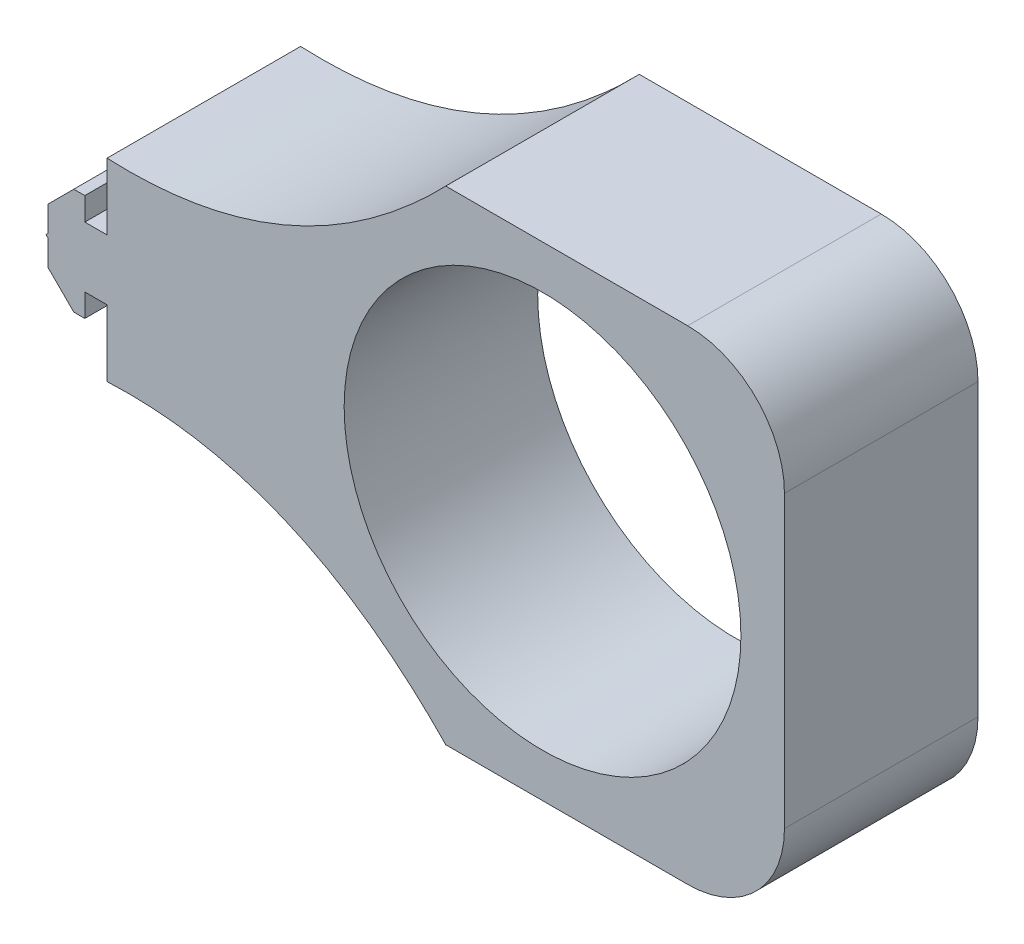
ISO-10303-21;
HEADER;
FILE_DESCRIPTION(('STEP AP214'),'2;1');
FILE_NAME('part.step','',(''),(''),'','','');
FILE_SCHEMA(('AUTOMOTIVE_DESIGN { 1 0 10303 214 1 1 1 1 }'));
ENDSEC;
DATA;
#1=APPLICATION_CONTEXT('core data for automotive mechanical design processes');
#2=APPLICATION_PROTOCOL_DEFINITION('international standard','automotive_design',2000,#1);
#3=PRODUCT_CONTEXT('',#1,'mechanical');
#4=PRODUCT('Part','Part','',(#3));
#5=PRODUCT_RELATED_PRODUCT_CATEGORY('part','',(#4));
#6=PRODUCT_DEFINITION_FORMATION('','',#4);
#7=PRODUCT_DEFINITION_CONTEXT('part definition',#1,'design');
#8=PRODUCT_DEFINITION('design','',#6,#7);
#9=PRODUCT_DEFINITION_SHAPE('','',#8);
#10=(LENGTH_UNIT() NAMED_UNIT(*) SI_UNIT(.MILLI.,.METRE.));
#11=(NAMED_UNIT(*) PLANE_ANGLE_UNIT() SI_UNIT($,.RADIAN.));
#12=(NAMED_UNIT(*) SI_UNIT($,.STERADIAN.) SOLID_ANGLE_UNIT());
#13=UNCERTAINTY_MEASURE_WITH_UNIT(LENGTH_MEASURE(1.E-05),#10,'distance_accuracy_value','');
#14=(GEOMETRIC_REPRESENTATION_CONTEXT(3) GLOBAL_UNCERTAINTY_ASSIGNED_CONTEXT((#13)) GLOBAL_UNIT_ASSIGNED_CONTEXT((#10,
#11,#12)) REPRESENTATION_CONTEXT('',''));
#15=CARTESIAN_POINT('',(0.,0.,0.));
#16=DIRECTION('',(0.,0.,1.));
#17=DIRECTION('',(1.,0.,0.));
#18=AXIS2_PLACEMENT_3D('',#15,#16,#17);
#19=CARTESIAN_POINT('',(-45.,0.,0.));
#20=DIRECTION('',(-1.,0.,0.));
#21=DIRECTION('',(0.,0.,1.));
#22=AXIS2_PLACEMENT_3D('',#19,#20,#21);
#23=PLANE('',#22);
#24=DIRECTION('',(0.,-1.,0.));
#25=VECTOR('',#24,1.);
#26=CARTESIAN_POINT('',(-45.,-25.,0.));
#27=LINE('',#26,#25);
#28=CARTESIAN_POINT('',(-45.,9.99999999999994,0.));
#29=VERTEX_POINT('',#28);
#30=CARTESIAN_POINT('',(-45.,3.12499999999995,0.));
#31=VERTEX_POINT('',#30);
#32=EDGE_CURVE('E343',#29,#31,#27,.T.);
#33=ORIENTED_EDGE('',*,*,#32,.T.);
#34=DIRECTION('',(0.,0.,1.));
#35=VECTOR('',#34,1.);
#36=CARTESIAN_POINT('',(-45.,3.12499999999995,0.));
#37=LINE('',#36,#35);
#38=CARTESIAN_POINT('',(-45.,3.12499999999995,20.));
#39=VERTEX_POINT('',#38);
#40=EDGE_CURVE('E273',#31,#39,#37,.T.);
#41=ORIENTED_EDGE('',*,*,#40,.T.);
#42=DIRECTION('',(0.,1.,0.));
#43=VECTOR('',#42,1.);
#44=CARTESIAN_POINT('',(-45.,-25.,20.));
#45=LINE('',#44,#43);
#46=CARTESIAN_POINT('',(-45.,9.99999999999994,20.));
#47=VERTEX_POINT('',#46);
#48=EDGE_CURVE('E342',#39,#47,#45,.T.);
#49=ORIENTED_EDGE('',*,*,#48,.T.);
#50=DIRECTION('',(0.,0.,1.));
#51=VECTOR('',#50,1.);
#52=CARTESIAN_POINT('',(-45.,9.99999999999994,0.));
#53=LINE('',#52,#51);
#54=EDGE_CURVE('E294',#29,#47,#53,.T.);
#55=ORIENTED_EDGE('',*,*,#54,.F.);
#56=EDGE_LOOP('',(#33,#41,#49,#55));
#57=FACE_BOUND('',#56,.T.);
#58=ADVANCED_FACE('F34',(#57),#23,.T.);
#59=CARTESIAN_POINT('',(0.,0.,20.));
#60=DIRECTION('',(0.,0.,-1.));
#61=DIRECTION('',(-1.,0.,0.));
#62=AXIS2_PLACEMENT_3D('',#59,#60,#61);
#63=PLANE('',#62);
#64=CARTESIAN_POINT('',(0.,0.,20.));
#65=DIRECTION('',(0.,0.,1.));
#66=DIRECTION('',(1.,0.,0.));
#67=AXIS2_PLACEMENT_3D('',#64,#65,#66);
#68=CIRCLE('',#67,20.5);
#69=CARTESIAN_POINT('',(20.5,0.,20.));
#70=VERTEX_POINT('',#69);
#71=EDGE_CURVE('E347',#70,#70,#68,.T.);
#72=ORIENTED_EDGE('',*,*,#71,.F.);
#73=EDGE_LOOP('',(#72));
#74=FACE_BOUND('',#73,.T.);
#75=DIRECTION('',(0.,1.,0.));
#76=VECTOR('',#75,1.);
#77=CARTESIAN_POINT('',(25.,-25.,20.));
#78=LINE('',#77,#76);
#79=CARTESIAN_POINT('',(25.,-15.,20.));
#80=VERTEX_POINT('',#79);
#81=CARTESIAN_POINT('',(25.,15.,20.));
#82=VERTEX_POINT('',#81);
#83=EDGE_CURVE('E353',#80,#82,#78,.T.);
#84=ORIENTED_EDGE('',*,*,#83,.T.);
#85=CARTESIAN_POINT('',(15.,15.,20.));
#86=DIRECTION('',(0.,0.,-1.));
#87=DIRECTION('',(-1.,0.,0.));
#88=AXIS2_PLACEMENT_3D('',#85,#86,#87);
#89=CIRCLE('',#88,10.);
#90=CARTESIAN_POINT('',(15.,25.,20.));
#91=VERTEX_POINT('',#90);
#92=EDGE_CURVE('E42',#82,#91,#89,.F.);
#93=ORIENTED_EDGE('',*,*,#92,.T.);
#94=DIRECTION('',(-1.,0.,0.));
#95=VECTOR('',#94,1.);
#96=CARTESIAN_POINT('',(-25.,25.,20.));
#97=LINE('',#96,#95);
#98=CARTESIAN_POINT('',(-9.99999999999998,25.,20.));
#99=VERTEX_POINT('',#98);
#100=EDGE_CURVE('E355',#91,#99,#97,.T.);
#101=ORIENTED_EDGE('',*,*,#100,.T.);
#102=CARTESIAN_POINT('',(-45.,10.,20.));
#103=CARTESIAN_POINT('',(-25.3728379068562,9.07216054686896,20.));
#104=CARTESIAN_POINT('',(-9.99999999999998,25.,20.));
#105=B_SPLINE_CURVE_WITH_KNOTS('',2,(#102,#103,#104),.UNSPECIFIED.,.F.,.F.,(3,3),(0.,1.),.UNSPECIFIED.);
#106=EDGE_CURVE('E295',#47,#99,#105,.T.);
#107=ORIENTED_EDGE('',*,*,#106,.F.);
#108=ORIENTED_EDGE('',*,*,#48,.F.);
#109=DIRECTION('',(-1.,0.,0.));
#110=VECTOR('',#109,1.);
#111=CARTESIAN_POINT('',(0.,3.12499999999995,20.));
#112=LINE('',#111,#110);
#113=CARTESIAN_POINT('',(-47.3,3.12499999999995,20.));
#114=VERTEX_POINT('',#113);
#115=EDGE_CURVE('E249',#39,#114,#112,.T.);
#116=ORIENTED_EDGE('',*,*,#115,.T.);
#117=DIRECTION('',(0.,1.,0.));
#118=VECTOR('',#117,1.);
#119=CARTESIAN_POINT('',(-47.3,0.,20.));
#120=LINE('',#119,#118);
#121=CARTESIAN_POINT('',(-47.3,5.49999999999994,20.));
#122=VERTEX_POINT('',#121);
#123=EDGE_CURVE('E252',#114,#122,#120,.T.);
#124=ORIENTED_EDGE('',*,*,#123,.T.);
#125=DIRECTION('',(1.,0.,0.));
#126=VECTOR('',#125,1.);
#127=CARTESIAN_POINT('',(0.,5.50000000000045,20.));
#128=LINE('',#127,#126);
#129=CARTESIAN_POINT('',(-48.4393398282203,5.49999999999994,20.));
#130=VERTEX_POINT('',#129);
#131=EDGE_CURVE('E255',#130,#122,#128,.T.);
#132=ORIENTED_EDGE('',*,*,#131,.F.);
#133=DIRECTION('',(0.707106781186536,0.707106781186559,0.));
#134=VECTOR('',#133,1.);
#135=CARTESIAN_POINT('',(-26.9696699141109,26.96966991411,20.));
#136=LINE('',#135,#134);
#137=CARTESIAN_POINT('',(-51.1,2.83933982822013,20.));
#138=VERTEX_POINT('',#137);
#139=EDGE_CURVE('E258',#138,#130,#136,.T.);
#140=ORIENTED_EDGE('',*,*,#139,.F.);
#141=DIRECTION('',(0.,1.,0.));
#142=VECTOR('',#141,1.);
#143=CARTESIAN_POINT('',(-51.1,-5.39416738276347E-13,20.));
#144=LINE('',#143,#142);
#145=CARTESIAN_POINT('',(-51.1,0.209999999999915,20.));
#146=VERTEX_POINT('',#145);
#147=EDGE_CURVE('E199',#146,#138,#144,.T.);
#148=ORIENTED_EDGE('',*,*,#147,.F.);
#149=DIRECTION('',(0.707106781186543,0.707106781186552,0.));
#150=VECTOR('',#149,1.);
#151=CARTESIAN_POINT('',(-25.6550000000003,25.655,20.));
#152=LINE('',#151,#150);
#153=CARTESIAN_POINT('',(-51.31,0.,20.));
#154=VERTEX_POINT('',#153);
#155=EDGE_CURVE('E232',#154,#146,#152,.T.);
#156=ORIENTED_EDGE('',*,*,#155,.F.);
#157=DIRECTION('',(0.70710678118655,-0.707106781186545,0.));
#158=VECTOR('',#157,1.);
#159=CARTESIAN_POINT('',(-25.6549999999998,-25.655,20.));
#160=LINE('',#159,#158);
#161=CARTESIAN_POINT('',(-51.1,-0.210000000000093,20.));
#162=VERTEX_POINT('',#161);
#163=EDGE_CURVE('E185',#154,#162,#160,.T.);
#164=ORIENTED_EDGE('',*,*,#163,.T.);
#165=DIRECTION('',(0.,-1.,0.));
#166=VECTOR('',#165,1.);
#167=CARTESIAN_POINT('',(-51.1,-5.39416738276347E-13,20.));
#168=LINE('',#167,#166);
#169=CARTESIAN_POINT('',(-51.1,-2.83933982822032,20.));
#170=VERTEX_POINT('',#169);
#171=EDGE_CURVE('E235',#162,#170,#168,.T.);
#172=ORIENTED_EDGE('',*,*,#171,.T.);
#173=DIRECTION('',(0.707106781186552,-0.707106781186544,0.));
#174=VECTOR('',#173,1.);
#175=CARTESIAN_POINT('',(-26.9696699141099,-26.9696699141102,20.));
#176=LINE('',#175,#174);
#177=CARTESIAN_POINT('',(-48.4393398282202,-5.50000000000006,20.));
#178=VERTEX_POINT('',#177);
#179=EDGE_CURVE('E238',#170,#178,#176,.T.);
#180=ORIENTED_EDGE('',*,*,#179,.T.);
#181=DIRECTION('',(1.,0.,0.));
#182=VECTOR('',#181,1.);
#183=CARTESIAN_POINT('',(0.,-5.49999999999955,20.));
#184=LINE('',#183,#182);
#185=CARTESIAN_POINT('',(-47.2999999999999,-5.50000000000004,20.));
#186=VERTEX_POINT('',#185);
#187=EDGE_CURVE('E241',#178,#186,#184,.T.);
#188=ORIENTED_EDGE('',*,*,#187,.T.);
#189=DIRECTION('',(0.,-1.,0.));
#190=VECTOR('',#189,1.);
#191=CARTESIAN_POINT('',(-47.3,-8.29161301022689E-13,20.));
#192=LINE('',#191,#190);
#193=CARTESIAN_POINT('',(-47.3,-3.12500000000006,20.));
#194=VERTEX_POINT('',#193);
#195=EDGE_CURVE('E244',#194,#186,#192,.T.);
#196=ORIENTED_EDGE('',*,*,#195,.F.);
#197=DIRECTION('',(-1.,0.,0.));
#198=VECTOR('',#197,1.);
#199=CARTESIAN_POINT('',(0.,-3.12499999999906,20.));
#200=LINE('',#199,#198);
#201=CARTESIAN_POINT('',(-45.,-3.12500000000003,20.));
#202=VERTEX_POINT('',#201);
#203=EDGE_CURVE('E247',#202,#194,#200,.T.);
#204=ORIENTED_EDGE('',*,*,#203,.F.);
#205=CARTESIAN_POINT('',(-45.,-10.,20.));
#206=VERTEX_POINT('',#205);
#207=EDGE_CURVE('E338',#206,#202,#45,.T.);
#208=ORIENTED_EDGE('',*,*,#207,.F.);
#209=CARTESIAN_POINT('',(-45.,-10.,20.));
#210=CARTESIAN_POINT('',(-25.3728379068562,-9.07216054686896,20.));
#211=CARTESIAN_POINT('',(-9.99999999999998,-25.,20.));
#212=B_SPLINE_CURVE_WITH_KNOTS('',2,(#209,#210,#211),.UNSPECIFIED.,.F.,.F.,(3,3),(0.,1.),.UNSPECIFIED.);
#213=CARTESIAN_POINT('',(-9.99999999999998,-25.,20.));
#214=VERTEX_POINT('',#213);
#215=EDGE_CURVE('E262',#206,#214,#212,.T.);
#216=ORIENTED_EDGE('',*,*,#215,.T.);
#217=DIRECTION('',(1.,0.,0.));
#218=VECTOR('',#217,1.);
#219=CARTESIAN_POINT('',(-25.,-25.,20.));
#220=LINE('',#219,#218);
#221=CARTESIAN_POINT('',(15.,-25.,20.));
#222=VERTEX_POINT('',#221);
#223=EDGE_CURVE('E358',#214,#222,#220,.T.);
#224=ORIENTED_EDGE('',*,*,#223,.T.);
#225=CARTESIAN_POINT('',(15.,-15.,20.));
#226=DIRECTION('',(0.,0.,-1.));
#227=DIRECTION('',(-1.,0.,0.));
#228=AXIS2_PLACEMENT_3D('',#225,#226,#227);
#229=CIRCLE('',#228,10.);
#230=EDGE_CURVE('E375',#222,#80,#229,.F.);
#231=ORIENTED_EDGE('',*,*,#230,.T.);
#232=EDGE_LOOP('',(#84,#93,#101,#107,#108,#116,#124,#132,#140,#148,#156,#164,#172,#180,#188,
#196,#204,#208,#216,#224,#231));
#233=FACE_BOUND('',#232,.T.);
#234=ADVANCED_FACE('F379',(#74,#233),#63,.F.);
#235=CARTESIAN_POINT('',(0.,0.,0.));
#236=DIRECTION('',(0.,0.,-1.));
#237=DIRECTION('',(-1.,0.,0.));
#238=AXIS2_PLACEMENT_3D('',#235,#236,#237);
#239=PLANE('',#238);
#240=DIRECTION('',(-1.,0.,0.));
#241=VECTOR('',#240,1.);
#242=CARTESIAN_POINT('',(-25.,25.,0.));
#243=LINE('',#242,#241);
#244=CARTESIAN_POINT('',(15.,25.,0.));
#245=VERTEX_POINT('',#244);
#246=CARTESIAN_POINT('',(-9.99999999999998,25.,0.));
#247=VERTEX_POINT('',#246);
#248=EDGE_CURVE('E362',#245,#247,#243,.T.);
#249=ORIENTED_EDGE('',*,*,#248,.F.);
#250=CARTESIAN_POINT('',(15.,15.,0.));
#251=DIRECTION('',(0.,0.,-1.));
#252=DIRECTION('',(-1.,0.,0.));
#253=AXIS2_PLACEMENT_3D('',#250,#251,#252);
#254=CIRCLE('',#253,10.);
#255=CARTESIAN_POINT('',(25.,15.,0.));
#256=VERTEX_POINT('',#255);
#257=EDGE_CURVE('E369',#245,#256,#254,.T.);
#258=ORIENTED_EDGE('',*,*,#257,.T.);
#259=DIRECTION('',(0.,1.,0.));
#260=VECTOR('',#259,1.);
#261=CARTESIAN_POINT('',(25.,-25.,0.));
#262=LINE('',#261,#260);
#263=CARTESIAN_POINT('',(25.,-15.,0.));
#264=VERTEX_POINT('',#263);
#265=EDGE_CURVE('E350',#264,#256,#262,.T.);
#266=ORIENTED_EDGE('',*,*,#265,.F.);
#267=CARTESIAN_POINT('',(15.,-15.,0.));
#268=DIRECTION('',(0.,0.,-1.));
#269=DIRECTION('',(-1.,0.,0.));
#270=AXIS2_PLACEMENT_3D('',#267,#268,#269);
#271=CIRCLE('',#270,10.);
#272=CARTESIAN_POINT('',(15.,-25.,0.));
#273=VERTEX_POINT('',#272);
#274=EDGE_CURVE('E367',#264,#273,#271,.T.);
#275=ORIENTED_EDGE('',*,*,#274,.T.);
#276=DIRECTION('',(1.,0.,0.));
#277=VECTOR('',#276,1.);
#278=CARTESIAN_POINT('',(-25.,-25.,0.));
#279=LINE('',#278,#277);
#280=CARTESIAN_POINT('',(-9.99999999999998,-25.,0.));
#281=VERTEX_POINT('',#280);
#282=EDGE_CURVE('E356',#281,#273,#279,.T.);
#283=ORIENTED_EDGE('',*,*,#282,.F.);
#284=CARTESIAN_POINT('',(-45.,-10.,0.));
#285=CARTESIAN_POINT('',(-25.3728379068562,-9.07216054686896,0.));
#286=CARTESIAN_POINT('',(-9.99999999999998,-25.,0.));
#287=B_SPLINE_CURVE_WITH_KNOTS('',2,(#284,#285,#286),.UNSPECIFIED.,.F.,.F.,(3,3),(0.,1.),.UNSPECIFIED.);
#288=CARTESIAN_POINT('',(-45.,-10.0000000000001,0.));
#289=VERTEX_POINT('',#288);
#290=EDGE_CURVE('E317',#289,#281,#287,.T.);
#291=ORIENTED_EDGE('',*,*,#290,.F.);
#292=CARTESIAN_POINT('',(-45.,-3.12500000000003,0.));
#293=VERTEX_POINT('',#292);
#294=EDGE_CURVE('E341',#293,#289,#27,.T.);
#295=ORIENTED_EDGE('',*,*,#294,.F.);
#296=DIRECTION('',(-1.,0.,0.));
#297=VECTOR('',#296,1.);
#298=CARTESIAN_POINT('',(0.,-3.12499999999906,0.));
#299=LINE('',#298,#297);
#300=CARTESIAN_POINT('',(-47.3,-3.12500000000006,0.));
#301=VERTEX_POINT('',#300);
#302=EDGE_CURVE('E219',#293,#301,#299,.T.);
#303=ORIENTED_EDGE('',*,*,#302,.T.);
#304=DIRECTION('',(0.,-1.,0.));
#305=VECTOR('',#304,1.);
#306=CARTESIAN_POINT('',(-47.3,-8.29161301022689E-13,0.));
#307=LINE('',#306,#305);
#308=CARTESIAN_POINT('',(-47.2999999999999,-5.50000000000004,0.));
#309=VERTEX_POINT('',#308);
#310=EDGE_CURVE('E217',#301,#309,#307,.T.);
#311=ORIENTED_EDGE('',*,*,#310,.T.);
#312=DIRECTION('',(1.,0.,0.));
#313=VECTOR('',#312,1.);
#314=CARTESIAN_POINT('',(0.,-5.49999999999955,0.));
#315=LINE('',#314,#313);
#316=CARTESIAN_POINT('',(-48.4393398282202,-5.50000000000006,0.));
#317=VERTEX_POINT('',#316);
#318=EDGE_CURVE('E214',#317,#309,#315,.T.);
#319=ORIENTED_EDGE('',*,*,#318,.F.);
#320=DIRECTION('',(0.707106781186552,-0.707106781186544,0.));
#321=VECTOR('',#320,1.);
#322=CARTESIAN_POINT('',(-26.9696699141099,-26.9696699141102,0.));
#323=LINE('',#322,#321);
#324=CARTESIAN_POINT('',(-51.1,-2.83933982822032,0.));
#325=VERTEX_POINT('',#324);
#326=EDGE_CURVE('E209',#325,#317,#323,.T.);
#327=ORIENTED_EDGE('',*,*,#326,.F.);
#328=DIRECTION('',(0.,-1.,0.));
#329=VECTOR('',#328,1.);
#330=CARTESIAN_POINT('',(-51.1,-5.39416738276347E-13,0.));
#331=LINE('',#330,#329);
#332=CARTESIAN_POINT('',(-51.1,-0.210000000000093,0.));
#333=VERTEX_POINT('',#332);
#334=EDGE_CURVE('E207',#333,#325,#331,.T.);
#335=ORIENTED_EDGE('',*,*,#334,.F.);
#336=DIRECTION('',(0.70710678118655,-0.707106781186545,0.));
#337=VECTOR('',#336,1.);
#338=CARTESIAN_POINT('',(-25.6549999999998,-25.655,0.));
#339=LINE('',#338,#337);
#340=CARTESIAN_POINT('',(-51.31,0.,0.));
#341=VERTEX_POINT('',#340);
#342=EDGE_CURVE('E183',#341,#333,#339,.T.);
#343=ORIENTED_EDGE('',*,*,#342,.F.);
#344=DIRECTION('',(0.707106781186543,0.707106781186552,0.));
#345=VECTOR('',#344,1.);
#346=CARTESIAN_POINT('',(-25.6550000000003,25.655,0.));
#347=LINE('',#346,#345);
#348=CARTESIAN_POINT('',(-51.1,0.209999999999915,0.));
#349=VERTEX_POINT('',#348);
#350=EDGE_CURVE('E194',#341,#349,#347,.T.);
#351=ORIENTED_EDGE('',*,*,#350,.T.);
#352=DIRECTION('',(0.,1.,0.));
#353=VECTOR('',#352,1.);
#354=CARTESIAN_POINT('',(-51.1,-5.39416738276347E-13,0.));
#355=LINE('',#354,#353);
#356=CARTESIAN_POINT('',(-51.1,2.83933982822013,0.));
#357=VERTEX_POINT('',#356);
#358=EDGE_CURVE('E190',#349,#357,#355,.T.);
#359=ORIENTED_EDGE('',*,*,#358,.T.);
#360=DIRECTION('',(0.707106781186536,0.707106781186559,0.));
#361=VECTOR('',#360,1.);
#362=CARTESIAN_POINT('',(-26.9696699141109,26.96966991411,0.));
#363=LINE('',#362,#361);
#364=CARTESIAN_POINT('',(-48.4393398282203,5.49999999999994,0.));
#365=VERTEX_POINT('',#364);
#366=EDGE_CURVE('E229',#357,#365,#363,.T.);
#367=ORIENTED_EDGE('',*,*,#366,.T.);
#368=DIRECTION('',(1.,0.,0.));
#369=VECTOR('',#368,1.);
#370=CARTESIAN_POINT('',(0.,5.50000000000045,0.));
#371=LINE('',#370,#369);
#372=CARTESIAN_POINT('',(-47.3,5.49999999999994,0.));
#373=VERTEX_POINT('',#372);
#374=EDGE_CURVE('E227',#365,#373,#371,.T.);
#375=ORIENTED_EDGE('',*,*,#374,.T.);
#376=DIRECTION('',(0.,1.,0.));
#377=VECTOR('',#376,1.);
#378=CARTESIAN_POINT('',(-47.3,0.,0.));
#379=LINE('',#378,#377);
#380=CARTESIAN_POINT('',(-47.3,3.12499999999995,0.));
#381=VERTEX_POINT('',#380);
#382=EDGE_CURVE('E224',#381,#373,#379,.T.);
#383=ORIENTED_EDGE('',*,*,#382,.F.);
#384=DIRECTION('',(-1.,0.,0.));
#385=VECTOR('',#384,1.);
#386=CARTESIAN_POINT('',(0.,3.12499999999995,0.));
#387=LINE('',#386,#385);
#388=EDGE_CURVE('E221',#31,#381,#387,.T.);
#389=ORIENTED_EDGE('',*,*,#388,.F.);
#390=ORIENTED_EDGE('',*,*,#32,.F.);
#391=CARTESIAN_POINT('',(-45.,10.,0.));
#392=CARTESIAN_POINT('',(-25.3728379068562,9.07216054686896,0.));
#393=CARTESIAN_POINT('',(-9.99999999999998,25.,0.));
#394=B_SPLINE_CURVE_WITH_KNOTS('',2,(#391,#392,#393),.UNSPECIFIED.,.F.,.F.,(3,3),(0.,1.),.UNSPECIFIED.);
#395=EDGE_CURVE('E288',#29,#247,#394,.T.);
#396=ORIENTED_EDGE('',*,*,#395,.T.);
#397=EDGE_LOOP('',(#249,#258,#266,#275,#283,#291,#295,#303,#311,#319,#327,#335,#343,#351,#359,
#367,#375,#383,#389,#390,#396));
#398=FACE_BOUND('',#397,.T.);
#399=CARTESIAN_POINT('',(0.,0.,0.));
#400=DIRECTION('',(0.,0.,1.));
#401=DIRECTION('',(1.,0.,0.));
#402=AXIS2_PLACEMENT_3D('',#399,#400,#401);
#403=CIRCLE('',#402,20.5);
#404=CARTESIAN_POINT('',(20.5,0.,0.));
#405=VERTEX_POINT('',#404);
#406=EDGE_CURVE('E346',#405,#405,#403,.T.);
#407=ORIENTED_EDGE('',*,*,#406,.T.);
#408=EDGE_LOOP('',(#407));
#409=FACE_BOUND('',#408,.T.);
#410=ADVANCED_FACE('F203',(#398,#409),#239,.T.);
#411=CARTESIAN_POINT('',(-25.,-25.,20.));
#412=DIRECTION('',(0.,1.,0.));
#413=DIRECTION('',(0.,0.,1.));
#414=AXIS2_PLACEMENT_3D('',#411,#412,#413);
#415=PLANE('',#414);
#416=ORIENTED_EDGE('',*,*,#282,.T.);
#417=DIRECTION('',(0.,0.,-1.));
#418=VECTOR('',#417,1.);
#419=CARTESIAN_POINT('',(15.,-25.,20.));
#420=LINE('',#419,#418);
#421=EDGE_CURVE('E11',#273,#222,#420,.F.);
#422=ORIENTED_EDGE('',*,*,#421,.T.);
#423=ORIENTED_EDGE('',*,*,#223,.F.);
#424=DIRECTION('',(0.,0.,1.));
#425=VECTOR('',#424,1.);
#426=CARTESIAN_POINT('',(-9.99999999999998,-25.,0.));
#427=LINE('',#426,#425);
#428=EDGE_CURVE('E331',#281,#214,#427,.T.);
#429=ORIENTED_EDGE('',*,*,#428,.F.);
#430=EDGE_LOOP('',(#416,#422,#423,#429));
#431=FACE_BOUND('',#430,.T.);
#432=ADVANCED_FACE('F398',(#431),#415,.F.);
#433=DIRECTION('',(0.,0.,1.));
#434=VECTOR('',#433,1.);
#435=CARTESIAN_POINT('',(-45.,-3.12500000000003,0.));
#436=LINE('',#435,#434);
#437=EDGE_CURVE('E276',#293,#202,#436,.T.);
#438=ORIENTED_EDGE('',*,*,#437,.F.);
#439=ORIENTED_EDGE('',*,*,#294,.T.);
#440=DIRECTION('',(0.,0.,1.));
#441=VECTOR('',#440,1.);
#442=CARTESIAN_POINT('',(-45.,-10.0000000000001,0.));
#443=LINE('',#442,#441);
#444=EDGE_CURVE('E323',#289,#206,#443,.T.);
#445=ORIENTED_EDGE('',*,*,#444,.T.);
#446=ORIENTED_EDGE('',*,*,#207,.T.);
#447=EDGE_LOOP('',(#438,#439,#445,#446));
#448=FACE_BOUND('',#447,.T.);
#449=ADVANCED_FACE('F315',(#448),#23,.T.);
#450=CARTESIAN_POINT('',(25.,-25.,20.));
#451=DIRECTION('',(-1.,0.,0.));
#452=DIRECTION('',(0.,0.,1.));
#453=AXIS2_PLACEMENT_3D('',#450,#451,#452);
#454=PLANE('',#453);
#455=ORIENTED_EDGE('',*,*,#265,.T.);
#456=DIRECTION('',(0.,0.,-1.));
#457=VECTOR('',#456,1.);
#458=CARTESIAN_POINT('',(25.,15.,20.));
#459=LINE('',#458,#457);
#460=EDGE_CURVE('E55',#256,#82,#459,.F.);
#461=ORIENTED_EDGE('',*,*,#460,.T.);
#462=ORIENTED_EDGE('',*,*,#83,.F.);
#463=DIRECTION('',(0.,0.,-1.));
#464=VECTOR('',#463,1.);
#465=CARTESIAN_POINT('',(25.,-15.,20.));
#466=LINE('',#465,#464);
#467=EDGE_CURVE('E371',#80,#264,#466,.T.);
#468=ORIENTED_EDGE('',*,*,#467,.T.);
#469=EDGE_LOOP('',(#455,#461,#462,#468));
#470=FACE_BOUND('',#469,.T.);
#471=ADVANCED_FACE('F391',(#470),#454,.F.);
#472=CARTESIAN_POINT('',(-25.,25.,20.));
#473=DIRECTION('',(0.,-1.,0.));
#474=DIRECTION('',(0.,0.,-1.));
#475=AXIS2_PLACEMENT_3D('',#472,#473,#474);
#476=PLANE('',#475);
#477=ORIENTED_EDGE('',*,*,#100,.F.);
#478=DIRECTION('',(0.,0.,-1.));
#479=VECTOR('',#478,1.);
#480=CARTESIAN_POINT('',(15.,25.,20.));
#481=LINE('',#480,#479);
#482=EDGE_CURVE('E360',#91,#245,#481,.T.);
#483=ORIENTED_EDGE('',*,*,#482,.T.);
#484=ORIENTED_EDGE('',*,*,#248,.T.);
#485=DIRECTION('',(0.,0.,1.));
#486=VECTOR('',#485,1.);
#487=CARTESIAN_POINT('',(-9.99999999999998,25.,0.));
#488=LINE('',#487,#486);
#489=EDGE_CURVE('E388',#247,#99,#488,.T.);
#490=ORIENTED_EDGE('',*,*,#489,.T.);
#491=EDGE_LOOP('',(#477,#483,#484,#490));
#492=FACE_BOUND('',#491,.T.);
#493=ADVANCED_FACE('F386',(#492),#476,.F.);
#494=CARTESIAN_POINT('',(0.,0.,20.));
#495=DIRECTION('',(0.,0.,-1.));
#496=DIRECTION('',(-1.,0.,0.));
#497=AXIS2_PLACEMENT_3D('',#494,#495,#496);
#498=CYLINDRICAL_SURFACE('',#497,20.5);
#499=ORIENTED_EDGE('',*,*,#71,.T.);
#500=EDGE_LOOP('',(#499));
#501=FACE_BOUND('',#500,.T.);
#502=ORIENTED_EDGE('',*,*,#406,.F.);
#503=EDGE_LOOP('',(#502));
#504=FACE_BOUND('',#503,.T.);
#505=ADVANCED_FACE('F313',(#501,#504),#498,.F.);
#506=DIRECTION('',(0.,0.,1.));
#507=VECTOR('',#506,1.);
#508=SURFACE_OF_LINEAR_EXTRUSION('',#287,#507);
#509=ORIENTED_EDGE('',*,*,#215,.F.);
#510=ORIENTED_EDGE('',*,*,#444,.F.);
#511=ORIENTED_EDGE('',*,*,#290,.T.);
#512=ORIENTED_EDGE('',*,*,#428,.T.);
#513=EDGE_LOOP('',(#509,#510,#511,#512));
#514=FACE_BOUND('',#513,.T.);
#515=ADVANCED_FACE('F307',(#514),#508,.T.);
#516=DIRECTION('',(0.,0.,1.));
#517=VECTOR('',#516,1.);
#518=SURFACE_OF_LINEAR_EXTRUSION('',#394,#517);
#519=ORIENTED_EDGE('',*,*,#106,.T.);
#520=ORIENTED_EDGE('',*,*,#489,.F.);
#521=ORIENTED_EDGE('',*,*,#395,.F.);
#522=ORIENTED_EDGE('',*,*,#54,.T.);
#523=EDGE_LOOP('',(#519,#520,#521,#522));
#524=FACE_BOUND('',#523,.T.);
#525=ADVANCED_FACE('F303',(#524),#518,.F.);
#526=CARTESIAN_POINT('',(-25.6550000000003,25.655,0.));
#527=DIRECTION('',(0.707106781186552,-0.707106781186543,0.));
#528=DIRECTION('',(0.707106781186543,0.707106781186552,0.));
#529=AXIS2_PLACEMENT_3D('',#526,#527,#528);
#530=PLANE('',#529);
#531=ORIENTED_EDGE('',*,*,#155,.T.);
#532=DIRECTION('',(0.,0.,1.));
#533=VECTOR('',#532,1.);
#534=CARTESIAN_POINT('',(-51.1,0.209999999999915,0.));
#535=LINE('',#534,#533);
#536=EDGE_CURVE('E197',#349,#146,#535,.T.);
#537=ORIENTED_EDGE('',*,*,#536,.F.);
#538=ORIENTED_EDGE('',*,*,#350,.F.);
#539=DIRECTION('',(0.,0.,1.));
#540=VECTOR('',#539,1.);
#541=CARTESIAN_POINT('',(-51.31,0.,0.));
#542=LINE('',#541,#540);
#543=EDGE_CURVE('E179',#341,#154,#542,.T.);
#544=ORIENTED_EDGE('',*,*,#543,.T.);
#545=EDGE_LOOP('',(#531,#537,#538,#544));
#546=FACE_BOUND('',#545,.T.);
#547=ADVANCED_FACE('F195',(#546),#530,.F.);
#548=CARTESIAN_POINT('',(-51.1,-5.39416738276347E-13,0.));
#549=DIRECTION('',(1.,0.,0.));
#550=DIRECTION('',(0.,1.,0.));
#551=AXIS2_PLACEMENT_3D('',#548,#549,#550);
#552=PLANE('',#551);
#553=ORIENTED_EDGE('',*,*,#147,.T.);
#554=DIRECTION('',(0.,0.,1.));
#555=VECTOR('',#554,1.);
#556=CARTESIAN_POINT('',(-51.1,2.83933982822013,0.));
#557=LINE('',#556,#555);
#558=EDGE_CURVE('E263',#357,#138,#557,.T.);
#559=ORIENTED_EDGE('',*,*,#558,.F.);
#560=ORIENTED_EDGE('',*,*,#358,.F.);
#561=ORIENTED_EDGE('',*,*,#536,.T.);
#562=EDGE_LOOP('',(#553,#559,#560,#561));
#563=FACE_BOUND('',#562,.T.);
#564=ADVANCED_FACE('F427',(#563),#552,.F.);
#565=CARTESIAN_POINT('',(-26.9696699141109,26.96966991411,0.));
#566=DIRECTION('',(0.707106781186559,-0.707106781186536,0.));
#567=DIRECTION('',(0.707106781186536,0.707106781186559,0.));
#568=AXIS2_PLACEMENT_3D('',#565,#566,#567);
#569=PLANE('',#568);
#570=ORIENTED_EDGE('',*,*,#139,.T.);
#571=DIRECTION('',(0.,0.,1.));
#572=VECTOR('',#571,1.);
#573=CARTESIAN_POINT('',(-48.4393398282203,5.49999999999994,0.));
#574=LINE('',#573,#572);
#575=EDGE_CURVE('E266',#365,#130,#574,.T.);
#576=ORIENTED_EDGE('',*,*,#575,.F.);
#577=ORIENTED_EDGE('',*,*,#366,.F.);
#578=ORIENTED_EDGE('',*,*,#558,.T.);
#579=EDGE_LOOP('',(#570,#576,#577,#578));
#580=FACE_BOUND('',#579,.T.);
#581=ADVANCED_FACE('F434',(#580),#569,.F.);
#582=CARTESIAN_POINT('',(0.,5.50000000000045,0.));
#583=DIRECTION('',(0.,-1.,0.));
#584=DIRECTION('',(1.,0.,0.));
#585=AXIS2_PLACEMENT_3D('',#582,#583,#584);
#586=PLANE('',#585);
#587=ORIENTED_EDGE('',*,*,#131,.T.);
#588=DIRECTION('',(0.,0.,1.));
#589=VECTOR('',#588,1.);
#590=CARTESIAN_POINT('',(-47.3,5.49999999999994,0.));
#591=LINE('',#590,#589);
#592=EDGE_CURVE('E269',#373,#122,#591,.T.);
#593=ORIENTED_EDGE('',*,*,#592,.F.);
#594=ORIENTED_EDGE('',*,*,#374,.F.);
#595=ORIENTED_EDGE('',*,*,#575,.T.);
#596=EDGE_LOOP('',(#587,#593,#594,#595));
#597=FACE_BOUND('',#596,.T.);
#598=ADVANCED_FACE('F436',(#597),#586,.F.);
#599=CARTESIAN_POINT('',(-47.3,0.,0.));
#600=DIRECTION('',(1.,0.,0.));
#601=DIRECTION('',(0.,0.,-1.));
#602=AXIS2_PLACEMENT_3D('',#599,#600,#601);
#603=PLANE('',#602);
#604=ORIENTED_EDGE('',*,*,#123,.F.);
#605=DIRECTION('',(0.,0.,1.));
#606=VECTOR('',#605,1.);
#607=CARTESIAN_POINT('',(-47.3,3.12499999999995,0.));
#608=LINE('',#607,#606);
#609=EDGE_CURVE('E271',#381,#114,#608,.T.);
#610=ORIENTED_EDGE('',*,*,#609,.F.);
#611=ORIENTED_EDGE('',*,*,#382,.T.);
#612=ORIENTED_EDGE('',*,*,#592,.T.);
#613=EDGE_LOOP('',(#604,#610,#611,#612));
#614=FACE_BOUND('',#613,.T.);
#615=ADVANCED_FACE('F439',(#614),#603,.T.);
#616=CARTESIAN_POINT('',(0.,3.12499999999995,0.));
#617=DIRECTION('',(0.,1.,0.));
#618=DIRECTION('',(0.,0.,1.));
#619=AXIS2_PLACEMENT_3D('',#616,#617,#618);
#620=PLANE('',#619);
#621=ORIENTED_EDGE('',*,*,#115,.F.);
#622=ORIENTED_EDGE('',*,*,#40,.F.);
#623=ORIENTED_EDGE('',*,*,#388,.T.);
#624=ORIENTED_EDGE('',*,*,#609,.T.);
#625=EDGE_LOOP('',(#621,#622,#623,#624));
#626=FACE_BOUND('',#625,.T.);
#627=ADVANCED_FACE('F443',(#626),#620,.T.);
#628=CARTESIAN_POINT('',(0.,-3.12499999999906,0.));
#629=DIRECTION('',(0.,1.,0.));
#630=DIRECTION('',(-1.,0.,0.));
#631=AXIS2_PLACEMENT_3D('',#628,#629,#630);
#632=PLANE('',#631);
#633=ORIENTED_EDGE('',*,*,#203,.T.);
#634=DIRECTION('',(0.,0.,1.));
#635=VECTOR('',#634,1.);
#636=CARTESIAN_POINT('',(-47.3,-3.12500000000006,0.));
#637=LINE('',#636,#635);
#638=EDGE_CURVE('E278',#301,#194,#637,.T.);
#639=ORIENTED_EDGE('',*,*,#638,.F.);
#640=ORIENTED_EDGE('',*,*,#302,.F.);
#641=ORIENTED_EDGE('',*,*,#437,.T.);
#642=EDGE_LOOP('',(#633,#639,#640,#641));
#643=FACE_BOUND('',#642,.T.);
#644=ADVANCED_FACE('F411',(#643),#632,.F.);
#645=CARTESIAN_POINT('',(-47.3,-8.29161301022689E-13,0.));
#646=DIRECTION('',(-1.,0.,0.));
#647=DIRECTION('',(0.,-1.,0.));
#648=AXIS2_PLACEMENT_3D('',#645,#646,#647);
#649=PLANE('',#648);
#650=ORIENTED_EDGE('',*,*,#195,.T.);
#651=DIRECTION('',(0.,0.,1.));
#652=VECTOR('',#651,1.);
#653=CARTESIAN_POINT('',(-47.2999999999999,-5.50000000000004,0.));
#654=LINE('',#653,#652);
#655=EDGE_CURVE('E281',#309,#186,#654,.T.);
#656=ORIENTED_EDGE('',*,*,#655,.F.);
#657=ORIENTED_EDGE('',*,*,#310,.F.);
#658=ORIENTED_EDGE('',*,*,#638,.T.);
#659=EDGE_LOOP('',(#650,#656,#657,#658));
#660=FACE_BOUND('',#659,.T.);
#661=ADVANCED_FACE('F413',(#660),#649,.F.);
#662=CARTESIAN_POINT('',(0.,-5.49999999999955,0.));
#663=DIRECTION('',(0.,-1.,0.));
#664=DIRECTION('',(1.,0.,0.));
#665=AXIS2_PLACEMENT_3D('',#662,#663,#664);
#666=PLANE('',#665);
#667=ORIENTED_EDGE('',*,*,#187,.F.);
#668=DIRECTION('',(0.,0.,1.));
#669=VECTOR('',#668,1.);
#670=CARTESIAN_POINT('',(-48.4393398282202,-5.50000000000006,0.));
#671=LINE('',#670,#669);
#672=EDGE_CURVE('E283',#317,#178,#671,.T.);
#673=ORIENTED_EDGE('',*,*,#672,.F.);
#674=ORIENTED_EDGE('',*,*,#318,.T.);
#675=ORIENTED_EDGE('',*,*,#655,.T.);
#676=EDGE_LOOP('',(#667,#673,#674,#675));
#677=FACE_BOUND('',#676,.T.);
#678=ADVANCED_FACE('F416',(#677),#666,.T.);
#679=CARTESIAN_POINT('',(-26.9696699141099,-26.9696699141102,0.));
#680=DIRECTION('',(-0.707106781186544,-0.707106781186552,0.));
#681=DIRECTION('',(0.707106781186552,-0.707106781186544,0.));
#682=AXIS2_PLACEMENT_3D('',#679,#680,#681);
#683=PLANE('',#682);
#684=ORIENTED_EDGE('',*,*,#179,.F.);
#685=DIRECTION('',(0.,0.,1.));
#686=VECTOR('',#685,1.);
#687=CARTESIAN_POINT('',(-51.1,-2.83933982822032,0.));
#688=LINE('',#687,#686);
#689=EDGE_CURVE('E285',#325,#170,#688,.T.);
#690=ORIENTED_EDGE('',*,*,#689,.F.);
#691=ORIENTED_EDGE('',*,*,#326,.T.);
#692=ORIENTED_EDGE('',*,*,#672,.T.);
#693=EDGE_LOOP('',(#684,#690,#691,#692));
#694=FACE_BOUND('',#693,.T.);
#695=ADVANCED_FACE('F419',(#694),#683,.T.);
#696=CARTESIAN_POINT('',(-51.1,-5.39416738276347E-13,0.));
#697=DIRECTION('',(-1.,0.,0.));
#698=DIRECTION('',(0.,-1.,0.));
#699=AXIS2_PLACEMENT_3D('',#696,#697,#698);
#700=PLANE('',#699);
#701=ORIENTED_EDGE('',*,*,#171,.F.);
#702=DIRECTION('',(0.,0.,1.));
#703=VECTOR('',#702,1.);
#704=CARTESIAN_POINT('',(-51.1,-0.210000000000093,0.));
#705=LINE('',#704,#703);
#706=EDGE_CURVE('E189',#333,#162,#705,.T.);
#707=ORIENTED_EDGE('',*,*,#706,.F.);
#708=ORIENTED_EDGE('',*,*,#334,.T.);
#709=ORIENTED_EDGE('',*,*,#689,.T.);
#710=EDGE_LOOP('',(#701,#707,#708,#709));
#711=FACE_BOUND('',#710,.T.);
#712=ADVANCED_FACE('F422',(#711),#700,.T.);
#713=CARTESIAN_POINT('',(-25.6549999999998,-25.655,0.));
#714=DIRECTION('',(-0.707106781186545,-0.70710678118655,0.));
#715=DIRECTION('',(0.70710678118655,-0.707106781186545,0.));
#716=AXIS2_PLACEMENT_3D('',#713,#714,#715);
#717=PLANE('',#716);
#718=ORIENTED_EDGE('',*,*,#163,.F.);
#719=ORIENTED_EDGE('',*,*,#543,.F.);
#720=ORIENTED_EDGE('',*,*,#342,.T.);
#721=ORIENTED_EDGE('',*,*,#706,.T.);
#722=EDGE_LOOP('',(#718,#719,#720,#721));
#723=FACE_BOUND('',#722,.T.);
#724=ADVANCED_FACE('F181',(#723),#717,.T.);
#725=CARTESIAN_POINT('',(15.,15.,20.));
#726=DIRECTION('',(0.,0.,-1.));
#727=DIRECTION('',(-1.,0.,0.));
#728=AXIS2_PLACEMENT_3D('',#725,#726,#727);
#729=CYLINDRICAL_SURFACE('',#728,10.);
#730=ORIENTED_EDGE('',*,*,#92,.F.);
#731=ORIENTED_EDGE('',*,*,#460,.F.);
#732=ORIENTED_EDGE('',*,*,#257,.F.);
#733=ORIENTED_EDGE('',*,*,#482,.F.);
#734=EDGE_LOOP('',(#730,#731,#732,#733));
#735=FACE_BOUND('',#734,.T.);
#736=ADVANCED_FACE('F389',(#735),#729,.T.);
#737=CARTESIAN_POINT('',(15.,-15.,20.));
#738=DIRECTION('',(0.,0.,-1.));
#739=DIRECTION('',(-1.,0.,0.));
#740=AXIS2_PLACEMENT_3D('',#737,#738,#739);
#741=CYLINDRICAL_SURFACE('',#740,10.);
#742=ORIENTED_EDGE('',*,*,#230,.F.);
#743=ORIENTED_EDGE('',*,*,#421,.F.);
#744=ORIENTED_EDGE('',*,*,#274,.F.);
#745=ORIENTED_EDGE('',*,*,#467,.F.);
#746=EDGE_LOOP('',(#742,#743,#744,#745));
#747=FACE_BOUND('',#746,.T.);
#748=ADVANCED_FACE('F36',(#747),#741,.T.);
#749=CLOSED_SHELL('',(#58,#234,#410,#432,#449,#471,#493,#505,#515,#525,#547,#564,#581,#598,#615,
#627,#644,#661,#678,#695,#712,#724,#736,#748));
#750=MANIFOLD_SOLID_BREP('B2',#749);
#751=ADVANCED_BREP_SHAPE_REPRESENTATION('',(#18,#750),#14);
#752=SHAPE_DEFINITION_REPRESENTATION(#9,#751);
ENDSEC;
END-ISO-10303-21;
